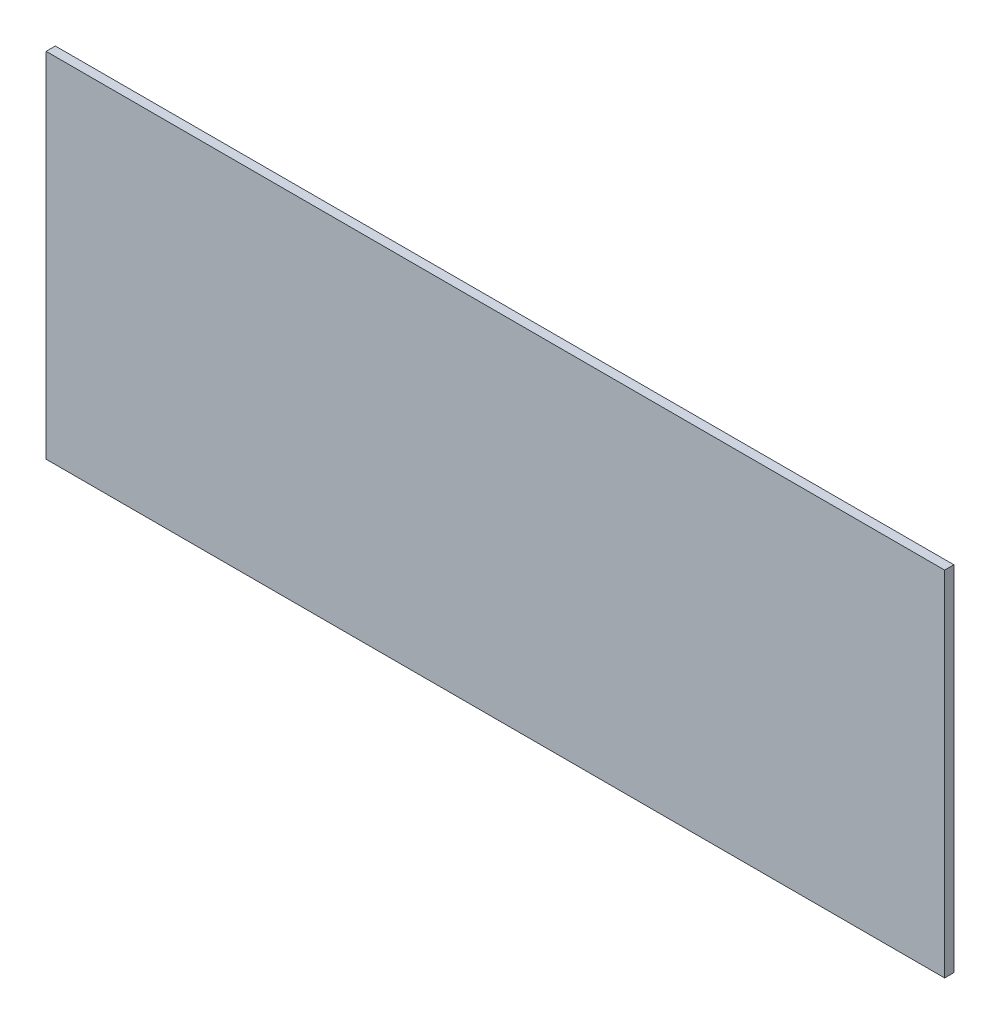
ISO-10303-21;
HEADER;
FILE_DESCRIPTION(('STEP AP214'),'2;1');
FILE_NAME('part.step','',(''),(''),'','','');
FILE_SCHEMA(('AUTOMOTIVE_DESIGN { 1 0 10303 214 1 1 1 1 }'));
ENDSEC;
DATA;
#1=APPLICATION_CONTEXT('core data for automotive mechanical design processes');
#2=APPLICATION_PROTOCOL_DEFINITION('international standard','automotive_design',2000,#1);
#3=PRODUCT_CONTEXT('',#1,'mechanical');
#4=PRODUCT('Part','Part','',(#3));
#5=PRODUCT_RELATED_PRODUCT_CATEGORY('part','',(#4));
#6=PRODUCT_DEFINITION_FORMATION('','',#4);
#7=PRODUCT_DEFINITION_CONTEXT('part definition',#1,'design');
#8=PRODUCT_DEFINITION('design','',#6,#7);
#9=PRODUCT_DEFINITION_SHAPE('','',#8);
#10=(LENGTH_UNIT() NAMED_UNIT(*) SI_UNIT(.MILLI.,.METRE.));
#11=(NAMED_UNIT(*) PLANE_ANGLE_UNIT() SI_UNIT($,.RADIAN.));
#12=(NAMED_UNIT(*) SI_UNIT($,.STERADIAN.) SOLID_ANGLE_UNIT());
#13=UNCERTAINTY_MEASURE_WITH_UNIT(LENGTH_MEASURE(1.E-05),#10,'distance_accuracy_value','');
#14=(GEOMETRIC_REPRESENTATION_CONTEXT(3) GLOBAL_UNCERTAINTY_ASSIGNED_CONTEXT((#13)) GLOBAL_UNIT_ASSIGNED_CONTEXT((#10,
#11,#12)) REPRESENTATION_CONTEXT('',''));
#15=CARTESIAN_POINT('',(0.,0.,0.));
#16=DIRECTION('',(0.,0.,1.));
#17=DIRECTION('',(1.,0.,0.));
#18=AXIS2_PLACEMENT_3D('',#15,#16,#17);
#19=CARTESIAN_POINT('',(-146.,57.3999999999999,3.));
#20=DIRECTION('',(0.,1.,0.));
#21=DIRECTION('',(0.,0.,1.));
#22=AXIS2_PLACEMENT_3D('',#19,#20,#21);
#23=PLANE('',#22);
#24=DIRECTION('',(1.,0.,0.));
#25=VECTOR('',#24,1.);
#26=CARTESIAN_POINT('',(-146.,57.3999999999999,0.));
#27=LINE('',#26,#25);
#28=CARTESIAN_POINT('',(-146.,57.3999999999999,0.));
#29=VERTEX_POINT('',#28);
#30=CARTESIAN_POINT('',(146.,57.3999999999999,0.));
#31=VERTEX_POINT('',#30);
#32=EDGE_CURVE('E100',#29,#31,#27,.T.);
#33=ORIENTED_EDGE('',*,*,#32,.F.);
#34=DIRECTION('',(0.,0.,-1.));
#35=VECTOR('',#34,1.);
#36=CARTESIAN_POINT('',(-146.,57.3999999999999,3.));
#37=LINE('',#36,#35);
#38=CARTESIAN_POINT('',(-146.,57.3999999999999,3.));
#39=VERTEX_POINT('',#38);
#40=EDGE_CURVE('E11',#39,#29,#37,.T.);
#41=ORIENTED_EDGE('',*,*,#40,.F.);
#42=DIRECTION('',(1.,0.,0.));
#43=VECTOR('',#42,1.);
#44=CARTESIAN_POINT('',(-146.,57.3999999999999,3.));
#45=LINE('',#44,#43);
#46=CARTESIAN_POINT('',(146.,57.3999999999999,3.));
#47=VERTEX_POINT('',#46);
#48=EDGE_CURVE('E94',#39,#47,#45,.T.);
#49=ORIENTED_EDGE('',*,*,#48,.T.);
#50=DIRECTION('',(0.,0.,-1.));
#51=VECTOR('',#50,1.);
#52=CARTESIAN_POINT('',(146.,57.3999999999999,3.));
#53=LINE('',#52,#51);
#54=EDGE_CURVE('E39',#47,#31,#53,.T.);
#55=ORIENTED_EDGE('',*,*,#54,.T.);
#56=EDGE_LOOP('',(#33,#41,#49,#55));
#57=FACE_BOUND('',#56,.T.);
#58=ADVANCED_FACE('F36',(#57),#23,.T.);
#59=CARTESIAN_POINT('',(-146.,-57.4,3.));
#60=DIRECTION('',(-1.,0.,0.));
#61=DIRECTION('',(0.,0.,1.));
#62=AXIS2_PLACEMENT_3D('',#59,#60,#61);
#63=PLANE('',#62);
#64=DIRECTION('',(0.,1.,0.));
#65=VECTOR('',#64,1.);
#66=CARTESIAN_POINT('',(-146.,-57.4,0.));
#67=LINE('',#66,#65);
#68=CARTESIAN_POINT('',(-146.,-57.4,0.));
#69=VERTEX_POINT('',#68);
#70=EDGE_CURVE('E96',#69,#29,#67,.T.);
#71=ORIENTED_EDGE('',*,*,#70,.F.);
#72=DIRECTION('',(0.,0.,-1.));
#73=VECTOR('',#72,1.);
#74=CARTESIAN_POINT('',(-146.,-57.4,3.));
#75=LINE('',#74,#73);
#76=CARTESIAN_POINT('',(-146.,-57.4,3.));
#77=VERTEX_POINT('',#76);
#78=EDGE_CURVE('E45',#77,#69,#75,.T.);
#79=ORIENTED_EDGE('',*,*,#78,.F.);
#80=DIRECTION('',(0.,1.,0.));
#81=VECTOR('',#80,1.);
#82=CARTESIAN_POINT('',(-146.,-57.4,3.));
#83=LINE('',#82,#81);
#84=EDGE_CURVE('E91',#77,#39,#83,.T.);
#85=ORIENTED_EDGE('',*,*,#84,.T.);
#86=ORIENTED_EDGE('',*,*,#40,.T.);
#87=EDGE_LOOP('',(#71,#79,#85,#86));
#88=FACE_BOUND('',#87,.T.);
#89=ADVANCED_FACE('F110',(#88),#63,.T.);
#90=CARTESIAN_POINT('',(146.,-57.4,3.));
#91=DIRECTION('',(0.,-1.,0.));
#92=DIRECTION('',(0.,0.,-1.));
#93=AXIS2_PLACEMENT_3D('',#90,#91,#92);
#94=PLANE('',#93);
#95=DIRECTION('',(-1.,0.,0.));
#96=VECTOR('',#95,1.);
#97=CARTESIAN_POINT('',(146.,-57.4,0.));
#98=LINE('',#97,#96);
#99=CARTESIAN_POINT('',(146.,-57.4,0.));
#100=VERTEX_POINT('',#99);
#101=EDGE_CURVE('E86',#100,#69,#98,.T.);
#102=ORIENTED_EDGE('',*,*,#101,.F.);
#103=DIRECTION('',(0.,0.,-1.));
#104=VECTOR('',#103,1.);
#105=CARTESIAN_POINT('',(146.,-57.4,3.));
#106=LINE('',#105,#104);
#107=CARTESIAN_POINT('',(146.,-57.4,3.));
#108=VERTEX_POINT('',#107);
#109=EDGE_CURVE('E81',#108,#100,#106,.T.);
#110=ORIENTED_EDGE('',*,*,#109,.F.);
#111=DIRECTION('',(-1.,0.,0.));
#112=VECTOR('',#111,1.);
#113=CARTESIAN_POINT('',(146.,-57.4,3.));
#114=LINE('',#113,#112);
#115=EDGE_CURVE('E84',#108,#77,#114,.T.);
#116=ORIENTED_EDGE('',*,*,#115,.T.);
#117=ORIENTED_EDGE('',*,*,#78,.T.);
#118=EDGE_LOOP('',(#102,#110,#116,#117));
#119=FACE_BOUND('',#118,.T.);
#120=ADVANCED_FACE('F83',(#119),#94,.T.);
#121=CARTESIAN_POINT('',(146.,57.3999999999999,3.));
#122=DIRECTION('',(1.,0.,0.));
#123=DIRECTION('',(0.,0.,-1.));
#124=AXIS2_PLACEMENT_3D('',#121,#122,#123);
#125=PLANE('',#124);
#126=DIRECTION('',(0.,-1.,0.));
#127=VECTOR('',#126,1.);
#128=CARTESIAN_POINT('',(146.,57.3999999999999,0.));
#129=LINE('',#128,#127);
#130=EDGE_CURVE('E103',#31,#100,#129,.T.);
#131=ORIENTED_EDGE('',*,*,#130,.F.);
#132=ORIENTED_EDGE('',*,*,#54,.F.);
#133=DIRECTION('',(0.,-1.,0.));
#134=VECTOR('',#133,1.);
#135=CARTESIAN_POINT('',(146.,57.3999999999999,3.));
#136=LINE('',#135,#134);
#137=EDGE_CURVE('E90',#47,#108,#136,.T.);
#138=ORIENTED_EDGE('',*,*,#137,.T.);
#139=ORIENTED_EDGE('',*,*,#109,.T.);
#140=EDGE_LOOP('',(#131,#132,#138,#139));
#141=FACE_BOUND('',#140,.T.);
#142=ADVANCED_FACE('F93',(#141),#125,.T.);
#143=CARTESIAN_POINT('',(0.,0.,3.));
#144=DIRECTION('',(0.,0.,-1.));
#145=DIRECTION('',(-1.,0.,0.));
#146=AXIS2_PLACEMENT_3D('',#143,#144,#145);
#147=PLANE('',#146);
#148=ORIENTED_EDGE('',*,*,#48,.F.);
#149=ORIENTED_EDGE('',*,*,#84,.F.);
#150=ORIENTED_EDGE('',*,*,#115,.F.);
#151=ORIENTED_EDGE('',*,*,#137,.F.);
#152=EDGE_LOOP('',(#148,#149,#150,#151));
#153=FACE_BOUND('',#152,.T.);
#154=ADVANCED_FACE('F89',(#153),#147,.F.);
#155=CARTESIAN_POINT('',(0.,0.,0.));
#156=DIRECTION('',(0.,0.,-1.));
#157=DIRECTION('',(-1.,0.,0.));
#158=AXIS2_PLACEMENT_3D('',#155,#156,#157);
#159=PLANE('',#158);
#160=ORIENTED_EDGE('',*,*,#32,.T.);
#161=ORIENTED_EDGE('',*,*,#130,.T.);
#162=ORIENTED_EDGE('',*,*,#101,.T.);
#163=ORIENTED_EDGE('',*,*,#70,.T.);
#164=EDGE_LOOP('',(#160,#161,#162,#163));
#165=FACE_BOUND('',#164,.T.);
#166=ADVANCED_FACE('F109',(#165),#159,.T.);
#167=CLOSED_SHELL('',(#58,#89,#120,#142,#154,#166));
#168=MANIFOLD_SOLID_BREP('B2',#167);
#169=ADVANCED_BREP_SHAPE_REPRESENTATION('',(#18,#168),#14);
#170=SHAPE_DEFINITION_REPRESENTATION(#9,#169);
ENDSEC;
END-ISO-10303-21;
